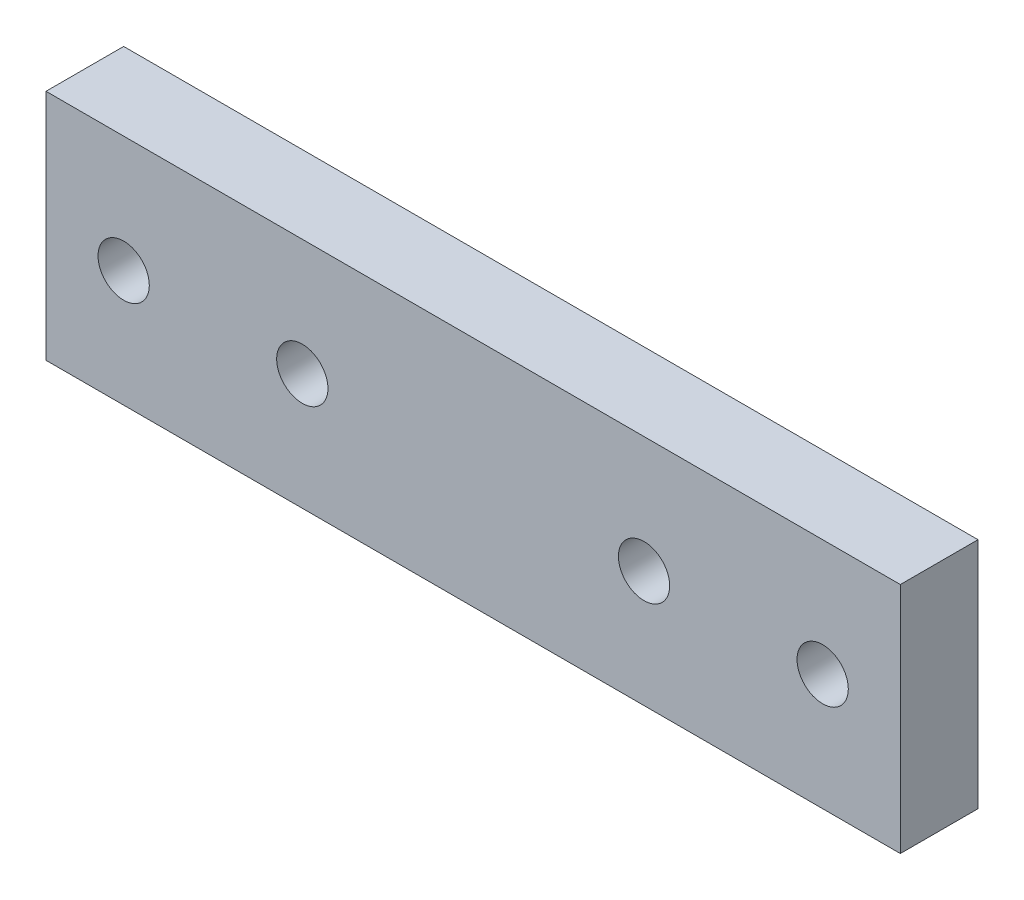
ISO-10303-21;
HEADER;
FILE_DESCRIPTION(('STEP AP214'),'2;1');
FILE_NAME('part.step','',(''),(''),'','','');
FILE_SCHEMA(('AUTOMOTIVE_DESIGN { 1 0 10303 214 1 1 1 1 }'));
ENDSEC;
DATA;
#1=APPLICATION_CONTEXT('core data for automotive mechanical design processes');
#2=APPLICATION_PROTOCOL_DEFINITION('international standard','automotive_design',2000,#1);
#3=PRODUCT_CONTEXT('',#1,'mechanical');
#4=PRODUCT('Part','Part','',(#3));
#5=PRODUCT_RELATED_PRODUCT_CATEGORY('part','',(#4));
#6=PRODUCT_DEFINITION_FORMATION('','',#4);
#7=PRODUCT_DEFINITION_CONTEXT('part definition',#1,'design');
#8=PRODUCT_DEFINITION('design','',#6,#7);
#9=PRODUCT_DEFINITION_SHAPE('','',#8);
#10=(LENGTH_UNIT() NAMED_UNIT(*) SI_UNIT(.MILLI.,.METRE.));
#11=(NAMED_UNIT(*) PLANE_ANGLE_UNIT() SI_UNIT($,.RADIAN.));
#12=(NAMED_UNIT(*) SI_UNIT($,.STERADIAN.) SOLID_ANGLE_UNIT());
#13=UNCERTAINTY_MEASURE_WITH_UNIT(LENGTH_MEASURE(1.E-05),#10,'distance_accuracy_value','');
#14=(GEOMETRIC_REPRESENTATION_CONTEXT(3) GLOBAL_UNCERTAINTY_ASSIGNED_CONTEXT((#13)) GLOBAL_UNIT_ASSIGNED_CONTEXT((#10,
#11,#12)) REPRESENTATION_CONTEXT('',''));
#15=CARTESIAN_POINT('',(0.,0.,0.));
#16=DIRECTION('',(0.,0.,1.));
#17=DIRECTION('',(1.,0.,0.));
#18=AXIS2_PLACEMENT_3D('',#15,#16,#17);
#19=CARTESIAN_POINT('',(-69.126560256915,704.486311853786,10.));
#20=DIRECTION('',(1.,0.,0.));
#21=DIRECTION('',(0.,0.,-1.));
#22=AXIS2_PLACEMENT_3D('',#19,#20,#21);
#23=PLANE('',#22);
#24=DIRECTION('',(0.,-1.,0.));
#25=VECTOR('',#24,1.);
#26=CARTESIAN_POINT('',(-69.126560256915,704.486311853786,0.));
#27=LINE('',#26,#25);
#28=CARTESIAN_POINT('',(-69.126560256915,704.486311853786,0.));
#29=VERTEX_POINT('',#28);
#30=CARTESIAN_POINT('',(-69.126560256915,674.486311853786,0.));
#31=VERTEX_POINT('',#30);
#32=EDGE_CURVE('E96',#29,#31,#27,.T.);
#33=ORIENTED_EDGE('',*,*,#32,.T.);
#34=DIRECTION('',(0.,0.,-1.));
#35=VECTOR('',#34,1.);
#36=CARTESIAN_POINT('',(-69.126560256915,674.486311853786,10.));
#37=LINE('',#36,#35);
#38=CARTESIAN_POINT('',(-69.126560256915,674.486311853786,10.));
#39=VERTEX_POINT('',#38);
#40=EDGE_CURVE('E11',#39,#31,#37,.T.);
#41=ORIENTED_EDGE('',*,*,#40,.F.);
#42=DIRECTION('',(0.,-1.,0.));
#43=VECTOR('',#42,1.);
#44=CARTESIAN_POINT('',(-69.126560256915,704.486311853786,10.));
#45=LINE('',#44,#43);
#46=CARTESIAN_POINT('',(-69.126560256915,704.486311853786,10.));
#47=VERTEX_POINT('',#46);
#48=EDGE_CURVE('E84',#47,#39,#45,.T.);
#49=ORIENTED_EDGE('',*,*,#48,.F.);
#50=DIRECTION('',(0.,0.,-1.));
#51=VECTOR('',#50,1.);
#52=CARTESIAN_POINT('',(-69.126560256915,704.486311853786,10.));
#53=LINE('',#52,#51);
#54=EDGE_CURVE('E92',#47,#29,#53,.T.);
#55=ORIENTED_EDGE('',*,*,#54,.T.);
#56=EDGE_LOOP('',(#33,#41,#49,#55));
#57=FACE_BOUND('',#56,.T.);
#58=ADVANCED_FACE('F33',(#57),#23,.F.);
#59=CARTESIAN_POINT('',(-69.126560256915,674.486311853786,10.));
#60=DIRECTION('',(0.,1.,0.));
#61=DIRECTION('',(0.,0.,1.));
#62=AXIS2_PLACEMENT_3D('',#59,#60,#61);
#63=PLANE('',#62);
#64=DIRECTION('',(1.,0.,0.));
#65=VECTOR('',#64,1.);
#66=CARTESIAN_POINT('',(-69.126560256915,674.486311853786,0.));
#67=LINE('',#66,#65);
#68=CARTESIAN_POINT('',(40.8734397430849,674.486311853786,0.));
#69=VERTEX_POINT('',#68);
#70=EDGE_CURVE('E88',#31,#69,#67,.T.);
#71=ORIENTED_EDGE('',*,*,#70,.T.);
#72=DIRECTION('',(0.,0.,-1.));
#73=VECTOR('',#72,1.);
#74=CARTESIAN_POINT('',(40.8734397430849,674.486311853786,10.));
#75=LINE('',#74,#73);
#76=CARTESIAN_POINT('',(40.8734397430849,674.486311853786,10.));
#77=VERTEX_POINT('',#76);
#78=EDGE_CURVE('E41',#77,#69,#75,.T.);
#79=ORIENTED_EDGE('',*,*,#78,.F.);
#80=DIRECTION('',(1.,0.,0.));
#81=VECTOR('',#80,1.);
#82=CARTESIAN_POINT('',(-69.126560256915,674.486311853786,10.));
#83=LINE('',#82,#81);
#84=EDGE_CURVE('E79',#39,#77,#83,.T.);
#85=ORIENTED_EDGE('',*,*,#84,.F.);
#86=ORIENTED_EDGE('',*,*,#40,.T.);
#87=EDGE_LOOP('',(#71,#79,#85,#86));
#88=FACE_BOUND('',#87,.T.);
#89=ADVANCED_FACE('F87',(#88),#63,.F.);
#90=CARTESIAN_POINT('',(40.8734397430849,674.486311853786,10.));
#91=DIRECTION('',(-1.,0.,0.));
#92=DIRECTION('',(0.,0.,1.));
#93=AXIS2_PLACEMENT_3D('',#90,#91,#92);
#94=PLANE('',#93);
#95=DIRECTION('',(0.,1.,0.));
#96=VECTOR('',#95,1.);
#97=CARTESIAN_POINT('',(40.8734397430849,674.486311853786,0.));
#98=LINE('',#97,#96);
#99=CARTESIAN_POINT('',(40.8734397430849,704.486311853786,0.));
#100=VERTEX_POINT('',#99);
#101=EDGE_CURVE('E66',#69,#100,#98,.T.);
#102=ORIENTED_EDGE('',*,*,#101,.T.);
#103=DIRECTION('',(0.,0.,-1.));
#104=VECTOR('',#103,1.);
#105=CARTESIAN_POINT('',(40.8734397430849,704.486311853786,10.));
#106=LINE('',#105,#104);
#107=CARTESIAN_POINT('',(40.8734397430849,704.486311853786,10.));
#108=VERTEX_POINT('',#107);
#109=EDGE_CURVE('E89',#108,#100,#106,.T.);
#110=ORIENTED_EDGE('',*,*,#109,.F.);
#111=DIRECTION('',(0.,1.,0.));
#112=VECTOR('',#111,1.);
#113=CARTESIAN_POINT('',(40.8734397430849,674.486311853786,10.));
#114=LINE('',#113,#112);
#115=EDGE_CURVE('E82',#77,#108,#114,.T.);
#116=ORIENTED_EDGE('',*,*,#115,.F.);
#117=ORIENTED_EDGE('',*,*,#78,.T.);
#118=EDGE_LOOP('',(#102,#110,#116,#117));
#119=FACE_BOUND('',#118,.T.);
#120=ADVANCED_FACE('F90',(#119),#94,.F.);
#121=CARTESIAN_POINT('',(40.8734397430849,704.486311853786,10.));
#122=DIRECTION('',(0.,-1.,0.));
#123=DIRECTION('',(0.,0.,-1.));
#124=AXIS2_PLACEMENT_3D('',#121,#122,#123);
#125=PLANE('',#124);
#126=DIRECTION('',(-1.,0.,0.));
#127=VECTOR('',#126,1.);
#128=CARTESIAN_POINT('',(40.8734397430849,704.486311853786,0.));
#129=LINE('',#128,#127);
#130=EDGE_CURVE('E72',#100,#29,#129,.T.);
#131=ORIENTED_EDGE('',*,*,#130,.T.);
#132=ORIENTED_EDGE('',*,*,#54,.F.);
#133=DIRECTION('',(-1.,0.,0.));
#134=VECTOR('',#133,1.);
#135=CARTESIAN_POINT('',(40.8734397430849,704.486311853786,10.));
#136=LINE('',#135,#134);
#137=EDGE_CURVE('E49',#108,#47,#136,.T.);
#138=ORIENTED_EDGE('',*,*,#137,.F.);
#139=ORIENTED_EDGE('',*,*,#109,.T.);
#140=EDGE_LOOP('',(#131,#132,#138,#139));
#141=FACE_BOUND('',#140,.T.);
#142=ADVANCED_FACE('F104',(#141),#125,.F.);
#143=CARTESIAN_POINT('',(0.,0.,10.));
#144=DIRECTION('',(0.,0.,1.));
#145=DIRECTION('',(1.,0.,0.));
#146=AXIS2_PLACEMENT_3D('',#143,#144,#145);
#147=PLANE('',#146);
#148=CARTESIAN_POINT('',(30.8734397430849,689.486311853786,10.0000000000001));
#149=DIRECTION('',(0.,0.,1.));
#150=DIRECTION('',(1.,0.,0.));
#151=AXIS2_PLACEMENT_3D('',#148,#149,#150);
#152=CIRCLE('',#151,3.29999999999998);
#153=CARTESIAN_POINT('',(34.1734397430848,689.486311853786,10.0000000000001));
#154=VERTEX_POINT('',#153);
#155=EDGE_CURVE('E130',#154,#154,#152,.T.);
#156=ORIENTED_EDGE('',*,*,#155,.F.);
#157=EDGE_LOOP('',(#156));
#158=FACE_BOUND('',#157,.T.);
#159=CARTESIAN_POINT('',(7.87343974308485,689.486311853786,10.0000000000001));
#160=DIRECTION('',(0.,0.,1.));
#161=DIRECTION('',(1.,0.,0.));
#162=AXIS2_PLACEMENT_3D('',#159,#160,#161);
#163=CIRCLE('',#162,3.29999999999998);
#164=CARTESIAN_POINT('',(11.1734397430848,689.486311853786,10.0000000000001));
#165=VERTEX_POINT('',#164);
#166=EDGE_CURVE('E124',#165,#165,#163,.T.);
#167=ORIENTED_EDGE('',*,*,#166,.F.);
#168=EDGE_LOOP('',(#167));
#169=FACE_BOUND('',#168,.T.);
#170=CARTESIAN_POINT('',(-36.1265602569154,689.486311853786,10.0000000000001));
#171=DIRECTION('',(0.,0.,1.));
#172=DIRECTION('',(1.,0.,0.));
#173=AXIS2_PLACEMENT_3D('',#170,#171,#172);
#174=CIRCLE('',#173,3.29999999999998);
#175=CARTESIAN_POINT('',(-32.8265602569154,689.486311853786,10.0000000000001));
#176=VERTEX_POINT('',#175);
#177=EDGE_CURVE('E118',#176,#176,#174,.T.);
#178=ORIENTED_EDGE('',*,*,#177,.F.);
#179=EDGE_LOOP('',(#178));
#180=FACE_BOUND('',#179,.T.);
#181=CARTESIAN_POINT('',(-59.1265602569151,689.486311853786,10.0000000000001));
#182=DIRECTION('',(0.,0.,1.));
#183=DIRECTION('',(1.,0.,0.));
#184=AXIS2_PLACEMENT_3D('',#181,#182,#183);
#185=CIRCLE('',#184,3.29999999999998);
#186=CARTESIAN_POINT('',(-55.8265602569151,689.486311853786,10.0000000000001));
#187=VERTEX_POINT('',#186);
#188=EDGE_CURVE('E112',#187,#187,#185,.T.);
#189=ORIENTED_EDGE('',*,*,#188,.F.);
#190=EDGE_LOOP('',(#189));
#191=FACE_BOUND('',#190,.T.);
#192=ORIENTED_EDGE('',*,*,#48,.T.);
#193=ORIENTED_EDGE('',*,*,#84,.T.);
#194=ORIENTED_EDGE('',*,*,#115,.T.);
#195=ORIENTED_EDGE('',*,*,#137,.T.);
#196=EDGE_LOOP('',(#192,#193,#194,#195));
#197=FACE_BOUND('',#196,.T.);
#198=ADVANCED_FACE('F80',(#158,#169,#180,#191,#197),#147,.T.);
#199=CARTESIAN_POINT('',(0.,0.,0.));
#200=DIRECTION('',(0.,0.,1.));
#201=DIRECTION('',(1.,0.,0.));
#202=AXIS2_PLACEMENT_3D('',#199,#200,#201);
#203=PLANE('',#202);
#204=CARTESIAN_POINT('',(30.8734397430849,689.486311853786,0.));
#205=DIRECTION('',(0.,0.,1.));
#206=DIRECTION('',(1.,0.,0.));
#207=AXIS2_PLACEMENT_3D('',#204,#205,#206);
#208=CIRCLE('',#207,3.29999999999998);
#209=CARTESIAN_POINT('',(34.1734397430848,689.486311853786,0.));
#210=VERTEX_POINT('',#209);
#211=EDGE_CURVE('E127',#210,#210,#208,.T.);
#212=ORIENTED_EDGE('',*,*,#211,.T.);
#213=EDGE_LOOP('',(#212));
#214=FACE_BOUND('',#213,.T.);
#215=CARTESIAN_POINT('',(7.87343974308485,689.486311853786,0.));
#216=DIRECTION('',(0.,0.,1.));
#217=DIRECTION('',(1.,0.,0.));
#218=AXIS2_PLACEMENT_3D('',#215,#216,#217);
#219=CIRCLE('',#218,3.29999999999998);
#220=CARTESIAN_POINT('',(11.1734397430848,689.486311853786,0.));
#221=VERTEX_POINT('',#220);
#222=EDGE_CURVE('E121',#221,#221,#219,.T.);
#223=ORIENTED_EDGE('',*,*,#222,.T.);
#224=EDGE_LOOP('',(#223));
#225=FACE_BOUND('',#224,.T.);
#226=CARTESIAN_POINT('',(-36.1265602569154,689.486311853786,0.));
#227=DIRECTION('',(0.,0.,1.));
#228=DIRECTION('',(1.,0.,0.));
#229=AXIS2_PLACEMENT_3D('',#226,#227,#228);
#230=CIRCLE('',#229,3.29999999999998);
#231=CARTESIAN_POINT('',(-32.8265602569154,689.486311853786,0.));
#232=VERTEX_POINT('',#231);
#233=EDGE_CURVE('E115',#232,#232,#230,.T.);
#234=ORIENTED_EDGE('',*,*,#233,.T.);
#235=EDGE_LOOP('',(#234));
#236=FACE_BOUND('',#235,.T.);
#237=CARTESIAN_POINT('',(-59.1265602569151,689.486311853786,0.));
#238=DIRECTION('',(0.,0.,1.));
#239=DIRECTION('',(1.,0.,0.));
#240=AXIS2_PLACEMENT_3D('',#237,#238,#239);
#241=CIRCLE('',#240,3.29999999999998);
#242=CARTESIAN_POINT('',(-55.8265602569151,689.486311853786,0.));
#243=VERTEX_POINT('',#242);
#244=EDGE_CURVE('E99',#243,#243,#241,.T.);
#245=ORIENTED_EDGE('',*,*,#244,.T.);
#246=EDGE_LOOP('',(#245));
#247=FACE_BOUND('',#246,.T.);
#248=ORIENTED_EDGE('',*,*,#32,.F.);
#249=ORIENTED_EDGE('',*,*,#130,.F.);
#250=ORIENTED_EDGE('',*,*,#101,.F.);
#251=ORIENTED_EDGE('',*,*,#70,.F.);
#252=EDGE_LOOP('',(#248,#249,#250,#251));
#253=FACE_BOUND('',#252,.T.);
#254=ADVANCED_FACE('F107',(#214,#225,#236,#247,#253),#203,.F.);
#255=CARTESIAN_POINT('',(-59.1265602569151,689.486311853786,10.0000000000001));
#256=DIRECTION('',(0.,0.,1.));
#257=DIRECTION('',(1.,0.,0.));
#258=AXIS2_PLACEMENT_3D('',#255,#256,#257);
#259=CYLINDRICAL_SURFACE('',#258,3.29999999999998);
#260=ORIENTED_EDGE('',*,*,#244,.F.);
#261=EDGE_LOOP('',(#260));
#262=FACE_BOUND('',#261,.T.);
#263=ORIENTED_EDGE('',*,*,#188,.T.);
#264=EDGE_LOOP('',(#263));
#265=FACE_BOUND('',#264,.T.);
#266=ADVANCED_FACE('F145',(#262,#265),#259,.F.);
#267=CARTESIAN_POINT('',(-36.1265602569154,689.486311853786,10.0000000000001));
#268=DIRECTION('',(0.,0.,1.));
#269=DIRECTION('',(1.,0.,0.));
#270=AXIS2_PLACEMENT_3D('',#267,#268,#269);
#271=CYLINDRICAL_SURFACE('',#270,3.29999999999998);
#272=ORIENTED_EDGE('',*,*,#233,.F.);
#273=EDGE_LOOP('',(#272));
#274=FACE_BOUND('',#273,.T.);
#275=ORIENTED_EDGE('',*,*,#177,.T.);
#276=EDGE_LOOP('',(#275));
#277=FACE_BOUND('',#276,.T.);
#278=ADVANCED_FACE('F147',(#274,#277),#271,.F.);
#279=CARTESIAN_POINT('',(7.87343974308485,689.486311853786,10.0000000000001));
#280=DIRECTION('',(0.,0.,1.));
#281=DIRECTION('',(1.,0.,0.));
#282=AXIS2_PLACEMENT_3D('',#279,#280,#281);
#283=CYLINDRICAL_SURFACE('',#282,3.29999999999998);
#284=ORIENTED_EDGE('',*,*,#222,.F.);
#285=EDGE_LOOP('',(#284));
#286=FACE_BOUND('',#285,.T.);
#287=ORIENTED_EDGE('',*,*,#166,.T.);
#288=EDGE_LOOP('',(#287));
#289=FACE_BOUND('',#288,.T.);
#290=ADVANCED_FACE('F154',(#286,#289),#283,.F.);
#291=CARTESIAN_POINT('',(30.8734397430849,689.486311853786,10.0000000000001));
#292=DIRECTION('',(0.,0.,1.));
#293=DIRECTION('',(1.,0.,0.));
#294=AXIS2_PLACEMENT_3D('',#291,#292,#293);
#295=CYLINDRICAL_SURFACE('',#294,3.29999999999998);
#296=ORIENTED_EDGE('',*,*,#211,.F.);
#297=EDGE_LOOP('',(#296));
#298=FACE_BOUND('',#297,.T.);
#299=ORIENTED_EDGE('',*,*,#155,.T.);
#300=EDGE_LOOP('',(#299));
#301=FACE_BOUND('',#300,.T.);
#302=ADVANCED_FACE('F134',(#298,#301),#295,.F.);
#303=CLOSED_SHELL('',(#58,#89,#120,#142,#198,#254,#266,#278,#290,#302));
#304=MANIFOLD_SOLID_BREP('B2',#303);
#305=ADVANCED_BREP_SHAPE_REPRESENTATION('',(#18,#304),#14);
#306=SHAPE_DEFINITION_REPRESENTATION(#9,#305);
ENDSEC;
END-ISO-10303-21;
